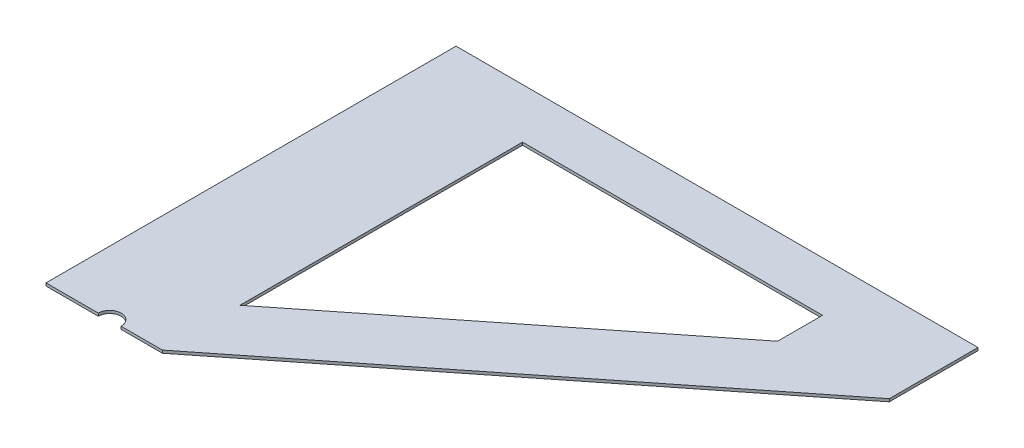
ISO-10303-21;
HEADER;
FILE_DESCRIPTION(('STEP AP214'),'2;1');
FILE_NAME('part.step','',(''),(''),'','','');
FILE_SCHEMA(('AUTOMOTIVE_DESIGN { 1 0 10303 214 1 1 1 1 }'));
ENDSEC;
DATA;
#1=APPLICATION_CONTEXT('core data for automotive mechanical design processes');
#2=APPLICATION_PROTOCOL_DEFINITION('international standard','automotive_design',2000,#1);
#3=PRODUCT_CONTEXT('',#1,'mechanical');
#4=PRODUCT('Part','Part','',(#3));
#5=PRODUCT_RELATED_PRODUCT_CATEGORY('part','',(#4));
#6=PRODUCT_DEFINITION_FORMATION('','',#4);
#7=PRODUCT_DEFINITION_CONTEXT('part definition',#1,'design');
#8=PRODUCT_DEFINITION('design','',#6,#7);
#9=PRODUCT_DEFINITION_SHAPE('','',#8);
#10=(LENGTH_UNIT() NAMED_UNIT(*) SI_UNIT(.MILLI.,.METRE.));
#11=(NAMED_UNIT(*) PLANE_ANGLE_UNIT() SI_UNIT($,.RADIAN.));
#12=(NAMED_UNIT(*) SI_UNIT($,.STERADIAN.) SOLID_ANGLE_UNIT());
#13=UNCERTAINTY_MEASURE_WITH_UNIT(LENGTH_MEASURE(1.E-05),#10,'distance_accuracy_value','');
#14=(GEOMETRIC_REPRESENTATION_CONTEXT(3) GLOBAL_UNCERTAINTY_ASSIGNED_CONTEXT((#13)) GLOBAL_UNIT_ASSIGNED_CONTEXT((#10,
#11,#12)) REPRESENTATION_CONTEXT('',''));
#15=CARTESIAN_POINT('',(0.,0.,0.));
#16=DIRECTION('',(0.,0.,1.));
#17=DIRECTION('',(1.,0.,0.));
#18=AXIS2_PLACEMENT_3D('',#15,#16,#17);
#19=CARTESIAN_POINT('',(0.,1.5875,704.85));
#20=DIRECTION('',(0.,0.,1.));
#21=DIRECTION('',(0.,-1.,0.));
#22=AXIS2_PLACEMENT_3D('',#19,#20,#21);
#23=PLANE('',#22);
#24=DIRECTION('',(-1.,0.,0.));
#25=VECTOR('',#24,1.);
#26=CARTESIAN_POINT('',(0.,-1.5875,704.85));
#27=LINE('',#26,#25);
#28=CARTESIAN_POINT('',(404.076843973137,-1.58750000000135,704.85));
#29=VERTEX_POINT('',#28);
#30=CARTESIAN_POINT('',(60.3249999999355,-1.5875000000002,704.85));
#31=VERTEX_POINT('',#30);
#32=EDGE_CURVE('E167',#29,#31,#27,.T.);
#33=ORIENTED_EDGE('',*,*,#32,.F.);
#34=DIRECTION('',(0.,-1.,0.));
#35=VECTOR('',#34,1.);
#36=CARTESIAN_POINT('',(404.076843973137,1.58749999999865,704.85));
#37=LINE('',#36,#35);
#38=CARTESIAN_POINT('',(404.076843973137,1.58749999999865,704.85));
#39=VERTEX_POINT('',#38);
#40=EDGE_CURVE('E11',#39,#29,#37,.T.);
#41=ORIENTED_EDGE('',*,*,#40,.F.);
#42=DIRECTION('',(-1.,0.,0.));
#43=VECTOR('',#42,1.);
#44=CARTESIAN_POINT('',(0.,1.5875,704.85));
#45=LINE('',#44,#43);
#46=CARTESIAN_POINT('',(60.3249999999355,1.5874999999998,704.85));
#47=VERTEX_POINT('',#46);
#48=EDGE_CURVE('E142',#39,#47,#45,.T.);
#49=ORIENTED_EDGE('',*,*,#48,.T.);
#50=DIRECTION('',(0.,-1.,0.));
#51=VECTOR('',#50,1.);
#52=CARTESIAN_POINT('',(60.3249999999355,1.5874999999998,704.85));
#53=LINE('',#52,#51);
#54=EDGE_CURVE('E53',#47,#31,#53,.T.);
#55=ORIENTED_EDGE('',*,*,#54,.T.);
#56=EDGE_LOOP('',(#33,#41,#49,#55));
#57=FACE_BOUND('',#56,.T.);
#58=ADVANCED_FACE('F34',(#57),#23,.T.);
#59=CARTESIAN_POINT('',(404.076843973137,1.58749999999865,0.));
#60=DIRECTION('',(-1.,0.,0.));
#61=DIRECTION('',(0.,-1.,0.));
#62=AXIS2_PLACEMENT_3D('',#59,#60,#61);
#63=PLANE('',#62);
#64=DIRECTION('',(0.,0.,-1.));
#65=VECTOR('',#64,1.);
#66=CARTESIAN_POINT('',(404.076843973137,-1.58750000000135,0.));
#67=LINE('',#66,#65);
#68=CARTESIAN_POINT('',(404.076843973137,-1.58750000000135,756.313435837429));
#69=VERTEX_POINT('',#68);
#70=EDGE_CURVE('E130',#69,#29,#67,.T.);
#71=ORIENTED_EDGE('',*,*,#70,.F.);
#72=DIRECTION('',(0.,-1.,0.));
#73=VECTOR('',#72,1.);
#74=CARTESIAN_POINT('',(404.076843973137,1.58749999999865,756.313435837429));
#75=LINE('',#74,#73);
#76=CARTESIAN_POINT('',(404.076843973137,1.58749999999865,756.313435837429));
#77=VERTEX_POINT('',#76);
#78=EDGE_CURVE('E44',#77,#69,#75,.T.);
#79=ORIENTED_EDGE('',*,*,#78,.F.);
#80=DIRECTION('',(0.,0.,-1.));
#81=VECTOR('',#80,1.);
#82=CARTESIAN_POINT('',(404.076843973137,1.58749999999865,0.));
#83=LINE('',#82,#81);
#84=EDGE_CURVE('E128',#77,#39,#83,.T.);
#85=ORIENTED_EDGE('',*,*,#84,.T.);
#86=ORIENTED_EDGE('',*,*,#40,.T.);
#87=EDGE_LOOP('',(#71,#79,#85,#86));
#88=FACE_BOUND('',#87,.T.);
#89=ADVANCED_FACE('F126',(#88),#63,.T.);
#90=CARTESIAN_POINT('',(523.99959269375,1.58749999999825,661.287485979583));
#91=DIRECTION('',(0.62105284614324,0.,0.783768691832852));
#92=DIRECTION('',(0.783768691832853,0.,-0.62105284614324));
#93=AXIS2_PLACEMENT_3D('',#90,#91,#92);
#94=PLANE('',#93);
#95=DIRECTION('',(-0.783768691832853,0.,0.62105284614324));
#96=VECTOR('',#95,1.);
#97=CARTESIAN_POINT('',(523.99959269375,-1.58750000000174,661.287485979583));
#98=LINE('',#97,#96);
#99=CARTESIAN_POINT('',(60.3249999999355,-1.5875000000002,1028.7));
#100=VERTEX_POINT('',#99);
#101=EDGE_CURVE('E170',#69,#100,#98,.T.);
#102=ORIENTED_EDGE('',*,*,#101,.T.);
#103=DIRECTION('',(0.,-1.,0.));
#104=VECTOR('',#103,1.);
#105=CARTESIAN_POINT('',(60.3249999999355,1.5874999999998,1028.7));
#106=LINE('',#105,#104);
#107=CARTESIAN_POINT('',(60.3249999999355,1.5874999999998,1028.7));
#108=VERTEX_POINT('',#107);
#109=EDGE_CURVE('E88',#108,#100,#106,.T.);
#110=ORIENTED_EDGE('',*,*,#109,.F.);
#111=DIRECTION('',(-0.783768691832853,0.,0.62105284614324));
#112=VECTOR('',#111,1.);
#113=CARTESIAN_POINT('',(523.99959269375,1.58749999999825,661.287485979583));
#114=LINE('',#113,#112);
#115=EDGE_CURVE('E134',#77,#108,#114,.T.);
#116=ORIENTED_EDGE('',*,*,#115,.F.);
#117=ORIENTED_EDGE('',*,*,#78,.T.);
#118=EDGE_LOOP('',(#102,#110,#116,#117));
#119=FACE_BOUND('',#118,.T.);
#120=ADVANCED_FACE('F135',(#119),#94,.F.);
#121=CARTESIAN_POINT('',(0.,1.5875,1117.6));
#122=DIRECTION('',(0.,-1.,0.));
#123=DIRECTION('',(1.,0.,0.));
#124=AXIS2_PLACEMENT_3D('',#121,#122,#123);
#125=CYLINDRICAL_SURFACE('',#124,13.081);
#126=CARTESIAN_POINT('',(0.,-1.5875,1117.6));
#127=DIRECTION('',(0.,1.,0.));
#128=DIRECTION('',(-1.,0.,0.));
#129=AXIS2_PLACEMENT_3D('',#126,#127,#128);
#130=CIRCLE('',#129,13.081);
#131=CARTESIAN_POINT('',(13.081,-1.58750000000004,1117.6));
#132=VERTEX_POINT('',#131);
#133=CARTESIAN_POINT('',(-13.081,-1.58749999999996,1117.6));
#134=VERTEX_POINT('',#133);
#135=EDGE_CURVE('E150',#132,#134,#130,.T.);
#136=ORIENTED_EDGE('',*,*,#135,.F.);
#137=DIRECTION('',(0.,-1.,0.));
#138=VECTOR('',#137,1.);
#139=CARTESIAN_POINT('',(13.081,1.58749999999996,1117.6));
#140=LINE('',#139,#138);
#141=CARTESIAN_POINT('',(13.081,1.58749999999996,1117.6));
#142=VERTEX_POINT('',#141);
#143=EDGE_CURVE('E38',#142,#132,#140,.T.);
#144=ORIENTED_EDGE('',*,*,#143,.F.);
#145=CARTESIAN_POINT('',(0.,1.5875,1117.6));
#146=DIRECTION('',(0.,1.,0.));
#147=DIRECTION('',(-1.,0.,0.));
#148=AXIS2_PLACEMENT_3D('',#145,#146,#147);
#149=CIRCLE('',#148,13.081);
#150=CARTESIAN_POINT('',(-13.081,1.58750000000004,1117.6));
#151=VERTEX_POINT('',#150);
#152=EDGE_CURVE('E175',#142,#151,#149,.T.);
#153=ORIENTED_EDGE('',*,*,#152,.T.);
#154=DIRECTION('',(0.,-1.,0.));
#155=VECTOR('',#154,1.);
#156=CARTESIAN_POINT('',(-13.081,1.58750000000004,1117.6));
#157=LINE('',#156,#155);
#158=EDGE_CURVE('E149',#151,#134,#157,.T.);
#159=ORIENTED_EDGE('',*,*,#158,.T.);
#160=EDGE_LOOP('',(#136,#144,#153,#159));
#161=FACE_BOUND('',#160,.T.);
#162=ADVANCED_FACE('F36',(#161),#125,.F.);
#163=CARTESIAN_POINT('',(0.,1.5875,1117.6));
#164=DIRECTION('',(0.,0.,-1.));
#165=DIRECTION('',(0.,1.,0.));
#166=AXIS2_PLACEMENT_3D('',#163,#164,#165);
#167=PLANE('',#166);
#168=DIRECTION('',(1.,0.,0.));
#169=VECTOR('',#168,1.);
#170=CARTESIAN_POINT('',(0.,-1.5875,1117.6));
#171=LINE('',#170,#169);
#172=CARTESIAN_POINT('',(60.3249999999355,-1.5875000000002,1117.6));
#173=VERTEX_POINT('',#172);
#174=EDGE_CURVE('E153',#132,#173,#171,.T.);
#175=ORIENTED_EDGE('',*,*,#174,.T.);
#176=DIRECTION('',(0.,-1.,0.));
#177=VECTOR('',#176,1.);
#178=CARTESIAN_POINT('',(60.3249999999355,1.5874999999998,1117.6));
#179=LINE('',#178,#177);
#180=CARTESIAN_POINT('',(60.3249999999355,1.5874999999998,1117.6));
#181=VERTEX_POINT('',#180);
#182=EDGE_CURVE('E188',#181,#173,#179,.T.);
#183=ORIENTED_EDGE('',*,*,#182,.F.);
#184=DIRECTION('',(1.,0.,0.));
#185=VECTOR('',#184,1.);
#186=CARTESIAN_POINT('',(0.,1.5875,1117.6));
#187=LINE('',#186,#185);
#188=EDGE_CURVE('E196',#142,#181,#187,.T.);
#189=ORIENTED_EDGE('',*,*,#188,.F.);
#190=ORIENTED_EDGE('',*,*,#143,.T.);
#191=EDGE_LOOP('',(#175,#183,#189,#190));
#192=FACE_BOUND('',#191,.T.);
#193=ADVANCED_FACE('F195',(#192),#167,.F.);
#194=CARTESIAN_POINT('',(567.27271464956,1.58749999999811,715.898165887821));
#195=DIRECTION('',(0.62105284614324,0.,0.783768691832852));
#196=DIRECTION('',(0.783768691832853,0.,-0.62105284614324));
#197=AXIS2_PLACEMENT_3D('',#194,#195,#196);
#198=PLANE('',#197);
#199=DIRECTION('',(-0.783768691832853,0.,0.62105284614324));
#200=VECTOR('',#199,1.);
#201=CARTESIAN_POINT('',(567.27271464956,-1.58750000000189,715.898165887821));
#202=LINE('',#201,#200);
#203=CARTESIAN_POINT('',(525.119599999988,-1.58750000000175,749.299999999997));
#204=VERTEX_POINT('',#203);
#205=EDGE_CURVE('E156',#204,#173,#202,.T.);
#206=ORIENTED_EDGE('',*,*,#205,.F.);
#207=DIRECTION('',(0.,-1.,0.));
#208=VECTOR('',#207,1.);
#209=CARTESIAN_POINT('',(525.119599999988,1.58749999999825,749.299999999997));
#210=LINE('',#209,#208);
#211=CARTESIAN_POINT('',(525.119599999988,1.58749999999825,749.299999999997));
#212=VERTEX_POINT('',#211);
#213=EDGE_CURVE('E187',#212,#204,#210,.T.);
#214=ORIENTED_EDGE('',*,*,#213,.F.);
#215=DIRECTION('',(-0.783768691832853,0.,0.62105284614324));
#216=VECTOR('',#215,1.);
#217=CARTESIAN_POINT('',(567.27271464956,1.58749999999811,715.898165887821));
#218=LINE('',#217,#216);
#219=EDGE_CURVE('E331',#212,#181,#218,.T.);
#220=ORIENTED_EDGE('',*,*,#219,.T.);
#221=ORIENTED_EDGE('',*,*,#182,.T.);
#222=EDGE_LOOP('',(#206,#214,#220,#221));
#223=FACE_BOUND('',#222,.T.);
#224=ADVANCED_FACE('F226',(#223),#198,.T.);
#225=CARTESIAN_POINT('',(525.119599999988,1.58749999999825,0.));
#226=DIRECTION('',(1.,0.,0.));
#227=DIRECTION('',(0.,1.,0.));
#228=AXIS2_PLACEMENT_3D('',#225,#226,#227);
#229=PLANE('',#228);
#230=DIRECTION('',(0.,0.,1.));
#231=VECTOR('',#230,1.);
#232=CARTESIAN_POINT('',(525.119599999988,-1.58750000000175,0.));
#233=LINE('',#232,#231);
#234=CARTESIAN_POINT('',(525.119599999988,-1.58750000000175,647.699999999998));
#235=VERTEX_POINT('',#234);
#236=EDGE_CURVE('E160',#235,#204,#233,.T.);
#237=ORIENTED_EDGE('',*,*,#236,.F.);
#238=DIRECTION('',(0.,-1.,0.));
#239=VECTOR('',#238,1.);
#240=CARTESIAN_POINT('',(525.119599999988,1.58749999999825,647.699999999998));
#241=LINE('',#240,#239);
#242=CARTESIAN_POINT('',(525.119599999988,1.58749999999825,647.699999999998));
#243=VERTEX_POINT('',#242);
#244=EDGE_CURVE('E185',#243,#235,#241,.T.);
#245=ORIENTED_EDGE('',*,*,#244,.F.);
#246=DIRECTION('',(0.,0.,1.));
#247=VECTOR('',#246,1.);
#248=CARTESIAN_POINT('',(525.119599999988,1.58749999999825,0.));
#249=LINE('',#248,#247);
#250=EDGE_CURVE('E224',#243,#212,#249,.T.);
#251=ORIENTED_EDGE('',*,*,#250,.T.);
#252=ORIENTED_EDGE('',*,*,#213,.T.);
#253=EDGE_LOOP('',(#237,#245,#251,#252));
#254=FACE_BOUND('',#253,.T.);
#255=ADVANCED_FACE('F223',(#254),#229,.T.);
#256=CARTESIAN_POINT('',(1.2550711317104E-13,1.5875,647.699999999998));
#257=DIRECTION('',(0.,0.,1.));
#258=DIRECTION('',(1.,0.,0.));
#259=AXIS2_PLACEMENT_3D('',#256,#257,#258);
#260=PLANE('',#259);
#261=DIRECTION('',(-1.,0.,0.));
#262=VECTOR('',#261,1.);
#263=CARTESIAN_POINT('',(1.14933560555563E-13,-1.5875,647.699999999998));
#264=LINE('',#263,#262);
#265=CARTESIAN_POINT('',(-73.0250000000645,-1.58749999999976,647.699999999998));
#266=VERTEX_POINT('',#265);
#267=EDGE_CURVE('E163',#235,#266,#264,.T.);
#268=ORIENTED_EDGE('',*,*,#267,.T.);
#269=DIRECTION('',(0.,-1.,0.));
#270=VECTOR('',#269,1.);
#271=CARTESIAN_POINT('',(-73.0250000000645,1.58750000000024,647.699999999998));
#272=LINE('',#271,#270);
#273=CARTESIAN_POINT('',(-73.0250000000645,1.58750000000024,647.699999999998));
#274=VERTEX_POINT('',#273);
#275=EDGE_CURVE('E182',#274,#266,#272,.T.);
#276=ORIENTED_EDGE('',*,*,#275,.F.);
#277=DIRECTION('',(-1.,0.,0.));
#278=VECTOR('',#277,1.);
#279=CARTESIAN_POINT('',(1.2550711317104E-13,1.5875,647.699999999998));
#280=LINE('',#279,#278);
#281=EDGE_CURVE('E219',#243,#274,#280,.T.);
#282=ORIENTED_EDGE('',*,*,#281,.F.);
#283=ORIENTED_EDGE('',*,*,#244,.T.);
#284=EDGE_LOOP('',(#268,#276,#282,#283));
#285=FACE_BOUND('',#284,.T.);
#286=ADVANCED_FACE('F218',(#285),#260,.F.);
#287=CARTESIAN_POINT('',(-73.0250000000645,1.58750000000024,0.));
#288=DIRECTION('',(1.,0.,0.));
#289=DIRECTION('',(0.,1.,0.));
#290=AXIS2_PLACEMENT_3D('',#287,#288,#289);
#291=PLANE('',#290);
#292=DIRECTION('',(0.,0.,1.));
#293=VECTOR('',#292,1.);
#294=CARTESIAN_POINT('',(-73.0250000000645,-1.58749999999976,0.));
#295=LINE('',#294,#293);
#296=CARTESIAN_POINT('',(-73.0250000000645,-1.58749999999976,1117.6));
#297=VERTEX_POINT('',#296);
#298=EDGE_CURVE('E165',#266,#297,#295,.T.);
#299=ORIENTED_EDGE('',*,*,#298,.T.);
#300=DIRECTION('',(0.,-1.,0.));
#301=VECTOR('',#300,1.);
#302=CARTESIAN_POINT('',(-73.0250000000645,1.58750000000024,1117.6));
#303=LINE('',#302,#301);
#304=CARTESIAN_POINT('',(-73.0250000000645,1.58750000000024,1117.6));
#305=VERTEX_POINT('',#304);
#306=EDGE_CURVE('E179',#305,#297,#303,.T.);
#307=ORIENTED_EDGE('',*,*,#306,.F.);
#308=DIRECTION('',(0.,0.,1.));
#309=VECTOR('',#308,1.);
#310=CARTESIAN_POINT('',(-73.0250000000645,1.58750000000024,0.));
#311=LINE('',#310,#309);
#312=EDGE_CURVE('E215',#274,#305,#311,.T.);
#313=ORIENTED_EDGE('',*,*,#312,.F.);
#314=ORIENTED_EDGE('',*,*,#275,.T.);
#315=EDGE_LOOP('',(#299,#307,#313,#314));
#316=FACE_BOUND('',#315,.T.);
#317=ADVANCED_FACE('F212',(#316),#291,.F.);
#318=EDGE_CURVE('E157',#297,#134,#171,.T.);
#319=ORIENTED_EDGE('',*,*,#318,.T.);
#320=ORIENTED_EDGE('',*,*,#158,.F.);
#321=EDGE_CURVE('E144',#305,#151,#187,.T.);
#322=ORIENTED_EDGE('',*,*,#321,.F.);
#323=ORIENTED_EDGE('',*,*,#306,.T.);
#324=EDGE_LOOP('',(#319,#320,#322,#323));
#325=FACE_BOUND('',#324,.T.);
#326=ADVANCED_FACE('F206',(#325),#167,.F.);
#327=CARTESIAN_POINT('',(60.3249999999355,1.5874999999998,0.));
#328=DIRECTION('',(1.,0.,0.));
#329=DIRECTION('',(0.,1.,0.));
#330=AXIS2_PLACEMENT_3D('',#327,#328,#329);
#331=PLANE('',#330);
#332=DIRECTION('',(0.,0.,1.));
#333=VECTOR('',#332,1.);
#334=CARTESIAN_POINT('',(60.3249999999354,-1.5875000000002,0.));
#335=LINE('',#334,#333);
#336=EDGE_CURVE('E172',#31,#100,#335,.T.);
#337=ORIENTED_EDGE('',*,*,#336,.F.);
#338=ORIENTED_EDGE('',*,*,#54,.F.);
#339=DIRECTION('',(0.,0.,1.));
#340=VECTOR('',#339,1.);
#341=CARTESIAN_POINT('',(60.3249999999355,1.5874999999998,0.));
#342=LINE('',#341,#340);
#343=EDGE_CURVE('E138',#47,#108,#342,.T.);
#344=ORIENTED_EDGE('',*,*,#343,.T.);
#345=ORIENTED_EDGE('',*,*,#109,.T.);
#346=EDGE_LOOP('',(#337,#338,#344,#345));
#347=FACE_BOUND('',#346,.T.);
#348=ADVANCED_FACE('F243',(#347),#331,.T.);
#349=CARTESIAN_POINT('',(0.,1.5875,0.));
#350=DIRECTION('',(0.,1.,0.));
#351=DIRECTION('',(-1.,0.,0.));
#352=AXIS2_PLACEMENT_3D('',#349,#350,#351);
#353=PLANE('',#352);
#354=ORIENTED_EDGE('',*,*,#152,.F.);
#355=ORIENTED_EDGE('',*,*,#188,.T.);
#356=ORIENTED_EDGE('',*,*,#219,.F.);
#357=ORIENTED_EDGE('',*,*,#250,.F.);
#358=ORIENTED_EDGE('',*,*,#281,.T.);
#359=ORIENTED_EDGE('',*,*,#312,.T.);
#360=ORIENTED_EDGE('',*,*,#321,.T.);
#361=EDGE_LOOP('',(#354,#355,#356,#357,#358,#359,#360));
#362=FACE_BOUND('',#361,.T.);
#363=ORIENTED_EDGE('',*,*,#48,.F.);
#364=ORIENTED_EDGE('',*,*,#84,.F.);
#365=ORIENTED_EDGE('',*,*,#115,.T.);
#366=ORIENTED_EDGE('',*,*,#343,.F.);
#367=EDGE_LOOP('',(#363,#364,#365,#366));
#368=FACE_BOUND('',#367,.T.);
#369=ADVANCED_FACE('F141',(#362,#368),#353,.T.);
#370=CARTESIAN_POINT('',(0.,-1.5875,0.));
#371=DIRECTION('',(0.,1.,0.));
#372=DIRECTION('',(-1.,0.,0.));
#373=AXIS2_PLACEMENT_3D('',#370,#371,#372);
#374=PLANE('',#373);
#375=ORIENTED_EDGE('',*,*,#135,.T.);
#376=ORIENTED_EDGE('',*,*,#318,.F.);
#377=ORIENTED_EDGE('',*,*,#298,.F.);
#378=ORIENTED_EDGE('',*,*,#267,.F.);
#379=ORIENTED_EDGE('',*,*,#236,.T.);
#380=ORIENTED_EDGE('',*,*,#205,.T.);
#381=ORIENTED_EDGE('',*,*,#174,.F.);
#382=EDGE_LOOP('',(#375,#376,#377,#378,#379,#380,#381));
#383=FACE_BOUND('',#382,.T.);
#384=ORIENTED_EDGE('',*,*,#32,.T.);
#385=ORIENTED_EDGE('',*,*,#336,.T.);
#386=ORIENTED_EDGE('',*,*,#101,.F.);
#387=ORIENTED_EDGE('',*,*,#70,.T.);
#388=EDGE_LOOP('',(#384,#385,#386,#387));
#389=FACE_BOUND('',#388,.T.);
#390=ADVANCED_FACE('F199',(#383,#389),#374,.F.);
#391=CLOSED_SHELL('',(#58,#89,#120,#162,#193,#224,#255,#286,#317,#326,#348,#369,#390));
#392=MANIFOLD_SOLID_BREP('B2',#391);
#393=ADVANCED_BREP_SHAPE_REPRESENTATION('',(#18,#392),#14);
#394=SHAPE_DEFINITION_REPRESENTATION(#9,#393);
ENDSEC;
END-ISO-10303-21;
